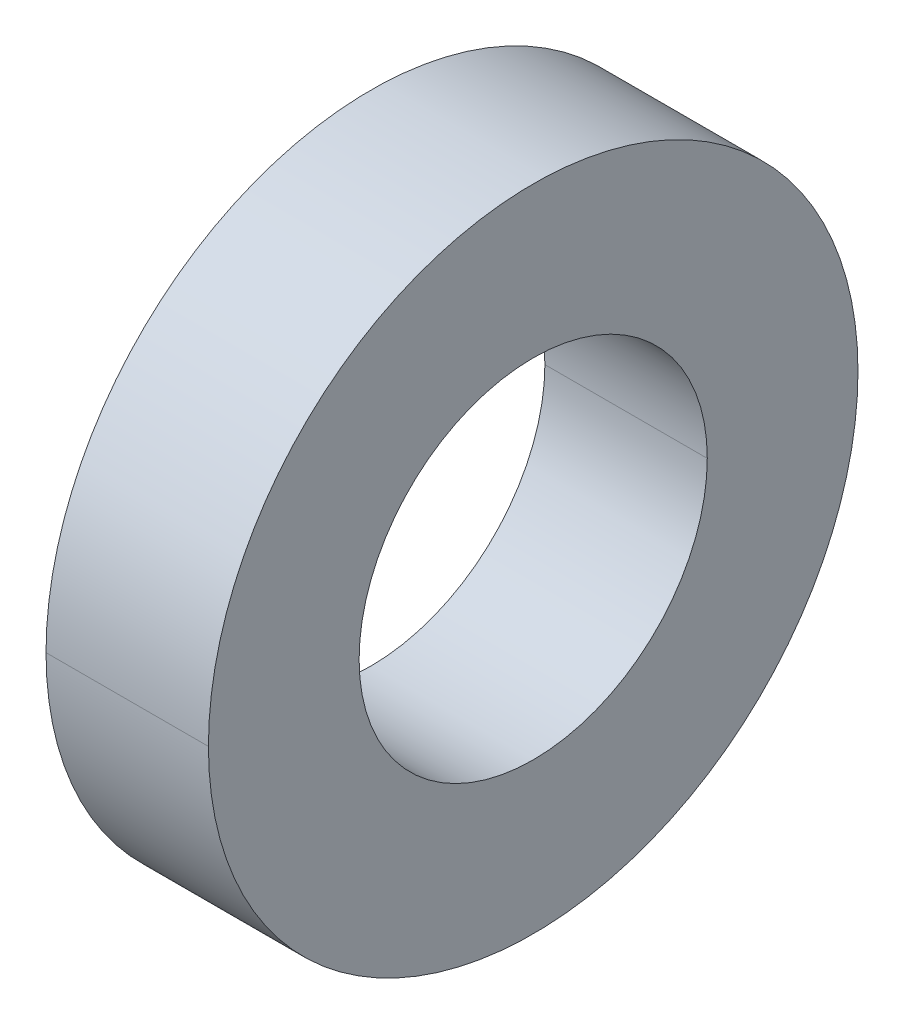
ISO-10303-21;
HEADER;
FILE_DESCRIPTION(('STEP AP214'),'2;1');
FILE_NAME('part.step','',(''),(''),'','','');
FILE_SCHEMA(('AUTOMOTIVE_DESIGN { 1 0 10303 214 1 1 1 1 }'));
ENDSEC;
DATA;
#1=APPLICATION_CONTEXT('core data for automotive mechanical design processes');
#2=APPLICATION_PROTOCOL_DEFINITION('international standard','automotive_design',2000,#1);
#3=PRODUCT_CONTEXT('',#1,'mechanical');
#4=PRODUCT('Part','Part','',(#3));
#5=PRODUCT_RELATED_PRODUCT_CATEGORY('part','',(#4));
#6=PRODUCT_DEFINITION_FORMATION('','',#4);
#7=PRODUCT_DEFINITION_CONTEXT('part definition',#1,'design');
#8=PRODUCT_DEFINITION('design','',#6,#7);
#9=PRODUCT_DEFINITION_SHAPE('','',#8);
#10=(LENGTH_UNIT() NAMED_UNIT(*) SI_UNIT(.MILLI.,.METRE.));
#11=(NAMED_UNIT(*) PLANE_ANGLE_UNIT() SI_UNIT($,.RADIAN.));
#12=(NAMED_UNIT(*) SI_UNIT($,.STERADIAN.) SOLID_ANGLE_UNIT());
#13=UNCERTAINTY_MEASURE_WITH_UNIT(LENGTH_MEASURE(1.E-05),#10,'distance_accuracy_value','');
#14=(GEOMETRIC_REPRESENTATION_CONTEXT(3) GLOBAL_UNCERTAINTY_ASSIGNED_CONTEXT((#13)) GLOBAL_UNIT_ASSIGNED_CONTEXT((#10,
#11,#12)) REPRESENTATION_CONTEXT('',''));
#15=CARTESIAN_POINT('',(0.,0.,0.));
#16=DIRECTION('',(0.,0.,1.));
#17=DIRECTION('',(1.,0.,0.));
#18=AXIS2_PLACEMENT_3D('',#15,#16,#17);
#19=CARTESIAN_POINT('',(1.190625,0.,0.));
#20=DIRECTION('',(-1.,0.,0.));
#21=DIRECTION('',(0.,0.,1.));
#22=AXIS2_PLACEMENT_3D('',#19,#20,#21);
#23=CYLINDRICAL_SURFACE('',#22,2.5527);
#24=DIRECTION('',(-1.,0.,0.));
#25=VECTOR('',#24,1.);
#26=CARTESIAN_POINT('',(1.190625,0.,-2.5527));
#27=LINE('',#26,#25);
#28=CARTESIAN_POINT('',(1.190625,0.,-2.5527));
#29=VERTEX_POINT('',#28);
#30=CARTESIAN_POINT('',(-1.190625,0.,-2.5527));
#31=VERTEX_POINT('',#30);
#32=EDGE_CURVE('E87',#29,#31,#27,.T.);
#33=ORIENTED_EDGE('',*,*,#32,.F.);
#34=CARTESIAN_POINT('',(1.190625,0.,0.));
#35=DIRECTION('',(1.,0.,0.));
#36=DIRECTION('',(0.,0.,-1.));
#37=AXIS2_PLACEMENT_3D('',#34,#35,#36);
#38=CIRCLE('',#37,2.5527);
#39=CARTESIAN_POINT('',(1.190625,0.,2.5527));
#40=VERTEX_POINT('',#39);
#41=EDGE_CURVE('E81',#29,#40,#38,.T.);
#42=ORIENTED_EDGE('',*,*,#41,.T.);
#43=DIRECTION('',(-1.,0.,0.));
#44=VECTOR('',#43,1.);
#45=CARTESIAN_POINT('',(1.190625,0.,2.5527));
#46=LINE('',#45,#44);
#47=CARTESIAN_POINT('',(-1.190625,0.,2.5527));
#48=VERTEX_POINT('',#47);
#49=EDGE_CURVE('E80',#40,#48,#46,.T.);
#50=ORIENTED_EDGE('',*,*,#49,.T.);
#51=CARTESIAN_POINT('',(-1.190625,0.,0.));
#52=DIRECTION('',(1.,0.,0.));
#53=DIRECTION('',(0.,0.,-1.));
#54=AXIS2_PLACEMENT_3D('',#51,#52,#53);
#55=CIRCLE('',#54,2.5527);
#56=EDGE_CURVE('E11',#31,#48,#55,.T.);
#57=ORIENTED_EDGE('',*,*,#56,.F.);
#58=EDGE_LOOP('',(#33,#42,#50,#57));
#59=FACE_BOUND('',#58,.T.);
#60=ADVANCED_FACE('F16',(#59),#23,.F.);
#61=CARTESIAN_POINT('',(1.190625,0.,0.));
#62=DIRECTION('',(-1.,0.,0.));
#63=DIRECTION('',(0.,0.,1.));
#64=AXIS2_PLACEMENT_3D('',#61,#62,#63);
#65=CYLINDRICAL_SURFACE('',#64,4.7625);
#66=DIRECTION('',(-1.,0.,0.));
#67=VECTOR('',#66,1.);
#68=CARTESIAN_POINT('',(1.190625,0.,-4.7625));
#69=LINE('',#68,#67);
#70=CARTESIAN_POINT('',(1.190625,0.,-4.7625));
#71=VERTEX_POINT('',#70);
#72=CARTESIAN_POINT('',(-1.190625,0.,-4.7625));
#73=VERTEX_POINT('',#72);
#74=EDGE_CURVE('E106',#71,#73,#69,.T.);
#75=ORIENTED_EDGE('',*,*,#74,.F.);
#76=CARTESIAN_POINT('',(1.190625,0.,0.));
#77=DIRECTION('',(1.,0.,0.));
#78=DIRECTION('',(0.,0.,-1.));
#79=AXIS2_PLACEMENT_3D('',#76,#77,#78);
#80=CIRCLE('',#79,4.7625);
#81=CARTESIAN_POINT('',(1.190625,0.,4.7625));
#82=VERTEX_POINT('',#81);
#83=EDGE_CURVE('E20',#82,#71,#80,.T.);
#84=ORIENTED_EDGE('',*,*,#83,.F.);
#85=DIRECTION('',(-1.,0.,0.));
#86=VECTOR('',#85,1.);
#87=CARTESIAN_POINT('',(1.190625,0.,4.7625));
#88=LINE('',#87,#86);
#89=CARTESIAN_POINT('',(-1.190625,0.,4.7625));
#90=VERTEX_POINT('',#89);
#91=EDGE_CURVE('E100',#82,#90,#88,.T.);
#92=ORIENTED_EDGE('',*,*,#91,.T.);
#93=CARTESIAN_POINT('',(-1.190625,0.,0.));
#94=DIRECTION('',(1.,0.,0.));
#95=DIRECTION('',(0.,0.,-1.));
#96=AXIS2_PLACEMENT_3D('',#93,#94,#95);
#97=CIRCLE('',#96,4.7625);
#98=EDGE_CURVE('E26',#90,#73,#97,.T.);
#99=ORIENTED_EDGE('',*,*,#98,.T.);
#100=EDGE_LOOP('',(#75,#84,#92,#99));
#101=FACE_BOUND('',#100,.T.);
#102=ADVANCED_FACE('F130',(#101),#65,.T.);
#103=CARTESIAN_POINT('',(-1.190625,0.,0.));
#104=DIRECTION('',(1.,0.,0.));
#105=DIRECTION('',(0.,1.,0.));
#106=AXIS2_PLACEMENT_3D('',#103,#104,#105);
#107=PLANE('',#106);
#108=CARTESIAN_POINT('',(-1.190625,0.,0.));
#109=DIRECTION('',(1.,0.,0.));
#110=DIRECTION('',(0.,0.,-1.));
#111=AXIS2_PLACEMENT_3D('',#108,#109,#110);
#112=CIRCLE('',#111,2.5527);
#113=EDGE_CURVE('E75',#48,#31,#112,.T.);
#114=ORIENTED_EDGE('',*,*,#113,.T.);
#115=ORIENTED_EDGE('',*,*,#56,.T.);
#116=EDGE_LOOP('',(#114,#115));
#117=FACE_BOUND('',#116,.T.);
#118=ORIENTED_EDGE('',*,*,#98,.F.);
#119=CARTESIAN_POINT('',(-1.190625,0.,0.));
#120=DIRECTION('',(1.,0.,0.));
#121=DIRECTION('',(0.,0.,-1.));
#122=AXIS2_PLACEMENT_3D('',#119,#120,#121);
#123=CIRCLE('',#122,4.7625);
#124=EDGE_CURVE('E103',#73,#90,#123,.T.);
#125=ORIENTED_EDGE('',*,*,#124,.F.);
#126=EDGE_LOOP('',(#118,#125));
#127=FACE_BOUND('',#126,.T.);
#128=ADVANCED_FACE('F73',(#117,#127),#107,.F.);
#129=CARTESIAN_POINT('',(1.190625,0.,0.));
#130=DIRECTION('',(1.,0.,0.));
#131=DIRECTION('',(0.,1.,0.));
#132=AXIS2_PLACEMENT_3D('',#129,#130,#131);
#133=PLANE('',#132);
#134=CARTESIAN_POINT('',(1.190625,0.,0.));
#135=DIRECTION('',(1.,0.,0.));
#136=DIRECTION('',(0.,0.,-1.));
#137=AXIS2_PLACEMENT_3D('',#134,#135,#136);
#138=CIRCLE('',#137,2.5527);
#139=EDGE_CURVE('E95',#40,#29,#138,.T.);
#140=ORIENTED_EDGE('',*,*,#139,.F.);
#141=ORIENTED_EDGE('',*,*,#41,.F.);
#142=EDGE_LOOP('',(#140,#141));
#143=FACE_BOUND('',#142,.T.);
#144=ORIENTED_EDGE('',*,*,#83,.T.);
#145=CARTESIAN_POINT('',(1.190625,0.,0.));
#146=DIRECTION('',(1.,0.,0.));
#147=DIRECTION('',(0.,0.,-1.));
#148=AXIS2_PLACEMENT_3D('',#145,#146,#147);
#149=CIRCLE('',#148,4.7625);
#150=EDGE_CURVE('E86',#71,#82,#149,.T.);
#151=ORIENTED_EDGE('',*,*,#150,.T.);
#152=EDGE_LOOP('',(#144,#151));
#153=FACE_BOUND('',#152,.T.);
#154=ADVANCED_FACE('F128',(#143,#153),#133,.T.);
#155=CARTESIAN_POINT('',(1.190625,0.,0.));
#156=DIRECTION('',(-1.,0.,0.));
#157=DIRECTION('',(0.,0.,1.));
#158=AXIS2_PLACEMENT_3D('',#155,#156,#157);
#159=CYLINDRICAL_SURFACE('',#158,4.7625);
#160=ORIENTED_EDGE('',*,*,#150,.F.);
#161=ORIENTED_EDGE('',*,*,#74,.T.);
#162=ORIENTED_EDGE('',*,*,#124,.T.);
#163=ORIENTED_EDGE('',*,*,#91,.F.);
#164=EDGE_LOOP('',(#160,#161,#162,#163));
#165=FACE_BOUND('',#164,.T.);
#166=ADVANCED_FACE('F131',(#165),#159,.T.);
#167=CARTESIAN_POINT('',(1.190625,0.,0.));
#168=DIRECTION('',(-1.,0.,0.));
#169=DIRECTION('',(0.,0.,1.));
#170=AXIS2_PLACEMENT_3D('',#167,#168,#169);
#171=CYLINDRICAL_SURFACE('',#170,2.5527);
#172=ORIENTED_EDGE('',*,*,#139,.T.);
#173=ORIENTED_EDGE('',*,*,#32,.T.);
#174=ORIENTED_EDGE('',*,*,#113,.F.);
#175=ORIENTED_EDGE('',*,*,#49,.F.);
#176=EDGE_LOOP('',(#172,#173,#174,#175));
#177=FACE_BOUND('',#176,.T.);
#178=ADVANCED_FACE('F18',(#177),#171,.F.);
#179=CLOSED_SHELL('',(#60,#102,#128,#154,#166,#178));
#180=MANIFOLD_SOLID_BREP('B1',#179);
#181=ADVANCED_BREP_SHAPE_REPRESENTATION('',(#18,#180),#14);
#182=SHAPE_DEFINITION_REPRESENTATION(#9,#181);
ENDSEC;
END-ISO-10303-21;
